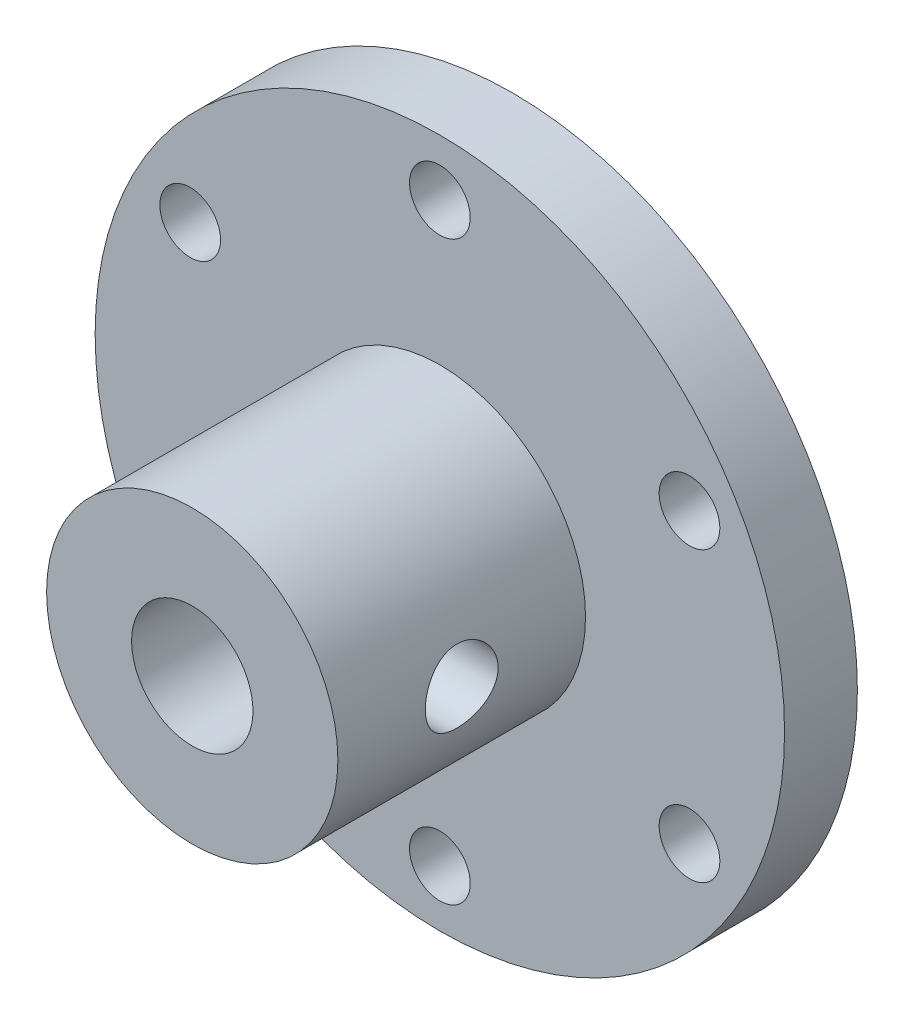
ISO-10303-21;
HEADER;
FILE_DESCRIPTION(('STEP AP214'),'2;1');
FILE_NAME('part.step','',(''),(''),'','','');
FILE_SCHEMA(('AUTOMOTIVE_DESIGN { 1 0 10303 214 1 1 1 1 }'));
ENDSEC;
DATA;
#1=APPLICATION_CONTEXT('core data for automotive mechanical design processes');
#2=APPLICATION_PROTOCOL_DEFINITION('international standard','automotive_design',2000,#1);
#3=PRODUCT_CONTEXT('',#1,'mechanical');
#4=PRODUCT('Part','Part','',(#3));
#5=PRODUCT_RELATED_PRODUCT_CATEGORY('part','',(#4));
#6=PRODUCT_DEFINITION_FORMATION('','',#4);
#7=PRODUCT_DEFINITION_CONTEXT('part definition',#1,'design');
#8=PRODUCT_DEFINITION('design','',#6,#7);
#9=PRODUCT_DEFINITION_SHAPE('','',#8);
#10=(LENGTH_UNIT() NAMED_UNIT(*) SI_UNIT(.MILLI.,.METRE.));
#11=(NAMED_UNIT(*) PLANE_ANGLE_UNIT() SI_UNIT($,.RADIAN.));
#12=(NAMED_UNIT(*) SI_UNIT($,.STERADIAN.) SOLID_ANGLE_UNIT());
#13=UNCERTAINTY_MEASURE_WITH_UNIT(LENGTH_MEASURE(1.E-05),#10,'distance_accuracy_value','');
#14=(GEOMETRIC_REPRESENTATION_CONTEXT(3) GLOBAL_UNCERTAINTY_ASSIGNED_CONTEXT((#13)) GLOBAL_UNIT_ASSIGNED_CONTEXT((#10,
#11,#12)) REPRESENTATION_CONTEXT('',''));
#15=CARTESIAN_POINT('',(0.,0.,0.));
#16=DIRECTION('',(0.,0.,1.));
#17=DIRECTION('',(1.,0.,0.));
#18=AXIS2_PLACEMENT_3D('',#15,#16,#17);
#19=CARTESIAN_POINT('',(0.,0.,8.5));
#20=DIRECTION('',(0.,0.,1.));
#21=DIRECTION('',(1.,0.,0.));
#22=AXIS2_PLACEMENT_3D('',#19,#20,#21);
#23=CYLINDRICAL_SURFACE('',#22,12.);
#24=CARTESIAN_POINT('',(12.,0.,21.7));
#25=CARTESIAN_POINT('',(11.9999957280688,0.165693664912072,21.6999928150083));
#26=CARTESIAN_POINT('',(11.9965326019779,0.331482235819507,21.6862218684386));
#27=CARTESIAN_POINT('',(11.9830467248771,0.658353835850523,21.6315669614701));
#28=CARTESIAN_POINT('',(11.9730175985364,0.819432132521742,21.5906566492892));
#29=CARTESIAN_POINT('',(11.9475117143636,1.13204869293379,21.4831183418444));
#30=CARTESIAN_POINT('',(11.9320423042694,1.28359950083382,21.416525022811));
#31=CARTESIAN_POINT('',(11.8973047647828,1.57336011717888,21.2596271489497));
#32=CARTESIAN_POINT('',(11.8780369283781,1.71157095336514,21.1693244227449));
#33=CARTESIAN_POINT('',(11.8373504038701,1.97358987521553,20.9656094560075));
#34=CARTESIAN_POINT('',(11.815898607181,2.09708539688872,20.8518018013217));
#35=CARTESIAN_POINT('',(11.7734768150593,2.32347646903238,20.6051222541331));
#36=CARTESIAN_POINT('',(11.7525069766943,2.42636538588808,20.4722442461153));
#37=CARTESIAN_POINT('',(11.713085365293,2.61009952988727,20.1887414660301));
#38=CARTESIAN_POINT('',(11.6946769146164,2.69058430328164,20.03787676286));
#39=CARTESIAN_POINT('',(11.6629766216083,2.82485050887593,19.7243211462168));
#40=CARTESIAN_POINT('',(11.6496788055226,2.87866313925013,19.5616443059887));
#41=CARTESIAN_POINT('',(11.6329502505524,2.9453717393525,19.2817883652429));
#42=CARTESIAN_POINT('',(11.62772978262,2.96582196889282,19.1664605922849));
#43=CARTESIAN_POINT('',(11.6207280430664,2.99313840725978,18.9341043479914));
#44=CARTESIAN_POINT('',(11.618946640573,3.00000513300127,18.8170759415436));
#45=CARTESIAN_POINT('',(11.6189548451231,2.99999273942974,18.5343974498881));
#46=CARTESIAN_POINT('',(11.6225306397938,2.98623642080573,18.368699792642));
#47=CARTESIAN_POINT('',(11.6364177572271,2.93164490603733,18.0420172911175));
#48=CARTESIAN_POINT('',(11.6467357131569,2.89078304193564,17.8810372513278));
#49=CARTESIAN_POINT('',(11.6728655332627,2.78338630466245,17.5686288556665));
#50=CARTESIAN_POINT('',(11.688669496401,2.71688833787691,17.4171871311521));
#51=CARTESIAN_POINT('',(11.7239804296828,2.56021536072405,17.1276112029638));
#52=CARTESIAN_POINT('',(11.7434871484607,2.47004195743034,16.9894760969148));
#53=CARTESIAN_POINT('',(11.7844864468452,2.26646114020776,16.72738001149));
#54=CARTESIAN_POINT('',(11.8060106893691,2.15262920183386,16.6037536770905));
#55=CARTESIAN_POINT('',(11.8483501328457,1.90584515126262,16.3771077273605));
#56=CARTESIAN_POINT('',(11.8691651177843,1.77288727725525,16.2740943442542));
#57=CARTESIAN_POINT('',(11.9080949390176,1.48930644060004,16.0902231746318));
#58=CARTESIAN_POINT('',(11.9261667116325,1.33845723582424,16.0097047642365));
#59=CARTESIAN_POINT('',(11.9571827004253,1.02493463089939,15.8753719353193));
#60=CARTESIAN_POINT('',(11.9701328195088,0.862275100148887,15.821526756666));
#61=CARTESIAN_POINT('',(11.9864068162275,0.582334104702279,15.7547313443809));
#62=CARTESIAN_POINT('',(11.9914779349958,0.466896521725037,15.7342422253925));
#63=CARTESIAN_POINT('',(11.9982759808765,0.234321744164557,15.7068742429655));
#64=CARTESIAN_POINT('',(12.0000030212656,0.11718460728703,15.6999949185117));
#65=CARTESIAN_POINT('',(11.9999957280688,-0.165693664912074,15.7000071849917));
#66=CARTESIAN_POINT('',(11.9965326019779,-0.331482235819508,15.7137781315614));
#67=CARTESIAN_POINT('',(11.9830467248771,-0.658353835850523,15.7684330385299));
#68=CARTESIAN_POINT('',(11.9730175985364,-0.819432132521743,15.8093433507108));
#69=CARTESIAN_POINT('',(11.9475117143636,-1.13204869293379,15.9168816581556));
#70=CARTESIAN_POINT('',(11.9320423042694,-1.28359950083381,15.983474977189));
#71=CARTESIAN_POINT('',(11.8973047647828,-1.57336011717887,16.1403728510503));
#72=CARTESIAN_POINT('',(11.8780369283781,-1.71157095336514,16.2306755772551));
#73=CARTESIAN_POINT('',(11.8373504038701,-1.97358987521553,16.4343905439925));
#74=CARTESIAN_POINT('',(11.815898607181,-2.09708539688872,16.5481981986783));
#75=CARTESIAN_POINT('',(11.7734768150593,-2.32347646903238,16.7948777458669));
#76=CARTESIAN_POINT('',(11.7525069766943,-2.42636538588808,16.9277557538847));
#77=CARTESIAN_POINT('',(11.713085365293,-2.61009952988726,17.2112585339699));
#78=CARTESIAN_POINT('',(11.6946769146164,-2.69058430328164,17.36212323714));
#79=CARTESIAN_POINT('',(11.6629766216083,-2.82485050887593,17.6756788537832));
#80=CARTESIAN_POINT('',(11.6496788055226,-2.87866313925013,17.8383556940113));
#81=CARTESIAN_POINT('',(11.6329502505524,-2.94537173935249,18.1182116347571));
#82=CARTESIAN_POINT('',(11.62772978262,-2.96582196889282,18.2335394077151));
#83=CARTESIAN_POINT('',(11.6207280430664,-2.99313840725978,18.4658956520086));
#84=CARTESIAN_POINT('',(11.618946640573,-3.00000513300126,18.5829240584564));
#85=CARTESIAN_POINT('',(11.6189548451231,-2.99999273942974,18.8656025501119));
#86=CARTESIAN_POINT('',(11.6225306397938,-2.98623642080573,19.0313002073581));
#87=CARTESIAN_POINT('',(11.6364177572271,-2.93164490603733,19.3579827088825));
#88=CARTESIAN_POINT('',(11.6467357131569,-2.89078304193563,19.5189627486722));
#89=CARTESIAN_POINT('',(11.6728655332627,-2.78338630466245,19.8313711443335));
#90=CARTESIAN_POINT('',(11.688669496401,-2.71688833787691,19.9828128688479));
#91=CARTESIAN_POINT('',(11.7239804296828,-2.56021536072405,20.2723887970362));
#92=CARTESIAN_POINT('',(11.7434871484607,-2.47004195743034,20.4105239030852));
#93=CARTESIAN_POINT('',(11.7844864468452,-2.26646114020776,20.67261998851));
#94=CARTESIAN_POINT('',(11.8060106893691,-2.15262920183386,20.7962463229095));
#95=CARTESIAN_POINT('',(11.8483501328457,-1.90584515126262,21.0228922726395));
#96=CARTESIAN_POINT('',(11.8691651177843,-1.77288727725525,21.1259056557458));
#97=CARTESIAN_POINT('',(11.9080949390176,-1.48930644060004,21.3097768253682));
#98=CARTESIAN_POINT('',(11.9261667116325,-1.33845723582424,21.3902952357635));
#99=CARTESIAN_POINT('',(11.9571827004253,-1.02493463089939,21.5246280646807));
#100=CARTESIAN_POINT('',(11.9701328195088,-0.862275100148888,21.578473243334));
#101=CARTESIAN_POINT('',(11.9864068162275,-0.58233410470228,21.6452686556191));
#102=CARTESIAN_POINT('',(11.9914779349957,-0.466896521725038,21.6657577746075));
#103=CARTESIAN_POINT('',(11.9982759808765,-0.234321744164558,21.6931257570345));
#104=CARTESIAN_POINT('',(12.0000030212656,-0.11718460728703,21.7000050814883));
#105=CARTESIAN_POINT('',(12.,0.,21.7));
#106=B_SPLINE_CURVE_WITH_KNOTS('',3,(#24,#25,#26,#27,#28,#29,#30,#31,#32,#33,#34,#35,#36,#37,
#38,#39,#40,#41,#42,#43,#44,#45,#46,#47,#48,#49,#50,#51,#52,#53,#54,#55,#56,#57,#58,#59,#60,#61,
#62,#63,#64,#65,#66,#67,#68,#69,#70,#71,#72,#73,#74,#75,#76,#77,#78,#79,#80,#81,#82,#83,#84,#85,
#86,#87,#88,#89,#90,#91,#92,#93,#94,#95,#96,#97,#98,#99,#100,#101,#102,#103,#104,#105),
.UNSPECIFIED.,.T.,.F.,(4,2,2,2,2,2,2,2,2,2,2,2,2,2,2,2,2,2,2,2,2,2,2,2,2,2,2,2,2,2,2,2,2,2,2,2,
2,2,2,2,4),(0.,0.496646768994113,0.993776479301541,1.49023732034909,1.98665988236264,
2.49223599127361,2.9979745930107,3.51143292555545,4.02428924459455,4.37522307199824,
4.7261435444973,5.22251644883704,5.71937843846639,6.21552778805021,6.71164346803405,
7.21757826769931,7.72366580389167,8.23702034208786,8.74978148277598,9.10104010300354,
9.45228682457151,9.94893359356562,10.4460633038731,10.9425241449206,11.4389467069341,
11.9445228158451,12.4502614175822,12.963719750127,13.4765760691661,13.8275098965697,
14.1784303690688,14.6748032734085,15.1716652630379,15.6678146126217,16.1639302926056,
16.6698650922708,17.1759526284632,17.6893071666594,18.2020683073475,18.553326927575,
18.904573649143),.UNSPECIFIED.);
#107=CARTESIAN_POINT('',(12.,0.,21.7));
#108=VERTEX_POINT('',#107);
#109=EDGE_CURVE('E147',#108,#108,#106,.T.);
#110=ORIENTED_EDGE('',*,*,#109,.T.);
#111=EDGE_LOOP('',(#110));
#112=FACE_BOUND('',#111,.T.);
#113=CARTESIAN_POINT('',(0.,0.,8.5));
#114=DIRECTION('',(0.,0.,1.));
#115=DIRECTION('',(1.,0.,0.));
#116=AXIS2_PLACEMENT_3D('',#113,#114,#115);
#117=CIRCLE('',#116,12.);
#118=CARTESIAN_POINT('',(12.,0.,8.5));
#119=VERTEX_POINT('',#118);
#120=EDGE_CURVE('E145',#119,#119,#117,.F.);
#121=ORIENTED_EDGE('',*,*,#120,.F.);
#122=EDGE_LOOP('',(#121));
#123=FACE_BOUND('',#122,.T.);
#124=CARTESIAN_POINT('',(0.,0.,28.9));
#125=DIRECTION('',(0.,0.,1.));
#126=DIRECTION('',(1.,0.,0.));
#127=AXIS2_PLACEMENT_3D('',#124,#125,#126);
#128=CIRCLE('',#127,12.);
#129=CARTESIAN_POINT('',(12.,0.,28.9));
#130=VERTEX_POINT('',#129);
#131=EDGE_CURVE('E18',#130,#130,#128,.T.);
#132=ORIENTED_EDGE('',*,*,#131,.F.);
#133=EDGE_LOOP('',(#132));
#134=FACE_BOUND('',#133,.T.);
#135=ADVANCED_FACE('F14',(#112,#123,#134),#23,.T.);
#136=CARTESIAN_POINT('',(0.,0.,28.9));
#137=DIRECTION('',(0.,0.,1.));
#138=DIRECTION('',(1.,0.,0.));
#139=AXIS2_PLACEMENT_3D('',#136,#137,#138);
#140=PLANE('',#139);
#141=CARTESIAN_POINT('',(0.,0.,28.9));
#142=DIRECTION('',(0.,0.,-1.));
#143=DIRECTION('',(-1.,0.,0.));
#144=AXIS2_PLACEMENT_3D('',#141,#142,#143);
#145=CIRCLE('',#144,5.);
#146=CARTESIAN_POINT('',(-5.,0.,28.9));
#147=VERTEX_POINT('',#146);
#148=EDGE_CURVE('E73',#147,#147,#145,.T.);
#149=ORIENTED_EDGE('',*,*,#148,.T.);
#150=EDGE_LOOP('',(#149));
#151=FACE_BOUND('',#150,.T.);
#152=ORIENTED_EDGE('',*,*,#131,.T.);
#153=EDGE_LOOP('',(#152));
#154=FACE_BOUND('',#153,.T.);
#155=ADVANCED_FACE('F96',(#151,#154),#140,.T.);
#156=CARTESIAN_POINT('',(0.,0.,18.7));
#157=DIRECTION('',(1.,0.,0.));
#158=DIRECTION('',(0.,0.,-1.));
#159=AXIS2_PLACEMENT_3D('',#156,#157,#158);
#160=CYLINDRICAL_SURFACE('',#159,3.);
#161=ORIENTED_EDGE('',*,*,#109,.F.);
#162=EDGE_LOOP('',(#161));
#163=FACE_BOUND('',#162,.T.);
#164=CARTESIAN_POINT('',(5.,0.,15.7));
#165=CARTESIAN_POINT('',(4.99999940658477,-0.0767678801192396,15.7000006638294));
#166=CARTESIAN_POINT('',(4.99822585644596,-0.153558360910736,15.7029533402229));
#167=CARTESIAN_POINT('',(4.99118391011725,-0.306542214499018,15.7147137136324));
#168=CARTESIAN_POINT('',(4.98591341133665,-0.382735200138676,15.7235249331885));
#169=CARTESIAN_POINT('',(4.96499419346863,-0.609803257129074,15.758647340939));
#170=CARTESIAN_POINT('',(4.94423817628654,-0.758979501121557,15.7936469314237));
#171=CARTESIAN_POINT('',(4.89123220723105,-1.04754257810959,15.8847730540608));
#172=CARTESIAN_POINT('',(4.85903938608577,-1.18697401956583,15.9407946510229));
#173=CARTESIAN_POINT('',(4.78590651439514,-1.45405202688125,16.0717215743141));
#174=CARTESIAN_POINT('',(4.74496874544088,-1.5817016542453,16.1466219760046));
#175=CARTESIAN_POINT('',(4.6541064732048,-1.83260392517862,16.3195513301363));
#176=CARTESIAN_POINT('',(4.60373407277412,-1.95477324953863,16.4189112381204));
#177=CARTESIAN_POINT('',(4.50060688577176,-2.18176827597789,16.6349382488957));
#178=CARTESIAN_POINT('',(4.44784918714059,-2.28657200763446,16.7516269270842));
#179=CARTESIAN_POINT('',(4.33822877092131,-2.48888664922791,17.0158304074759));
#180=CARTESIAN_POINT('',(4.28165482129482,-2.58393171086636,17.1653703345512));
#181=CARTESIAN_POINT('',(4.17877805624258,-2.74721032414936,17.4816449452268));
#182=CARTESIAN_POINT('',(4.13246121160821,-2.81548059698938,17.6483556800609));
#183=CARTESIAN_POINT('',(4.06520495639378,-2.91150900031344,17.9620096892649));
#184=CARTESIAN_POINT('',(4.04110959631816,-2.94451164891567,18.1066550775168));
#185=CARTESIAN_POINT('',(4.00851821707227,-2.98874141767498,18.4008718283708));
#186=CARTESIAN_POINT('',(3.99999982256373,-2.99999977346019,18.5504358106183));
#187=CARTESIAN_POINT('',(4.00000017905266,-3.00000022860352,18.850926672365));
#188=CARTESIAN_POINT('',(4.00867484002758,-2.98853627761798,19.0018535556553));
#189=CARTESIAN_POINT('',(4.04184585380817,-2.94350523117549,19.2986372285078));
#190=CARTESIAN_POINT('',(4.06636051746079,-2.90991255430844,19.4444879441847));
#191=CARTESIAN_POINT('',(4.1272476102406,-2.82286919080426,19.7261656395809));
#192=CARTESIAN_POINT('',(4.16353352125618,-2.76956300898167,19.8620571458067));
#193=CARTESIAN_POINT('',(4.24371784163998,-2.64505835505252,20.1228752513206));
#194=CARTESIAN_POINT('',(4.28761852590751,-2.57385453319611,20.2477985570331));
#195=CARTESIAN_POINT('',(4.38457062340518,-2.40542826131656,20.499894402425));
#196=CARTESIAN_POINT('',(4.43808463292361,-2.30608927828072,20.6254752487185));
#197=CARTESIAN_POINT('',(4.54452181352423,-2.08854170196272,20.8595239641548));
#198=CARTESIAN_POINT('',(4.59744447461112,-1.97031799153217,20.9679779838505));
#199=CARTESIAN_POINT('',(4.70352345672635,-1.70285624255232,21.1762911741899));
#200=CARTESIAN_POINT('',(4.75608536975912,-1.55164647299247,21.2739503656662));
#201=CARTESIAN_POINT('',(4.84889364787066,-1.23122585670127,21.4416513780307));
#202=CARTESIAN_POINT('',(4.88915660884575,-1.06203968636522,21.5117304520128));
#203=CARTESIAN_POINT('',(4.9463758590619,-0.744461592464488,21.6099634002227));
#204=CARTESIAN_POINT('',(4.96631834251902,-0.598289219453495,21.6435750363725));
#205=CARTESIAN_POINT('',(4.99312645036289,-0.301410439906223,21.6885865062652));
#206=CARTESIAN_POINT('',(5.00000005056663,-0.150706855814995,21.6999998874925));
#207=CARTESIAN_POINT('',(4.99999994841007,0.153756652819247,21.7000001147843));
#208=CARTESIAN_POINT('',(4.99284523226386,0.307516711119343,21.6881203549708));
#209=CARTESIAN_POINT('',(4.96495385242821,0.610218227121317,21.6412778103412));
#210=CARTESIAN_POINT('',(4.94421137738968,0.75915759444665,21.60630514887));
#211=CARTESIAN_POINT('',(4.89123745097885,1.04748196309147,21.515237801128));
#212=CARTESIAN_POINT('',(4.85905368077838,1.18690379631333,21.4592307211368));
#213=CARTESIAN_POINT('',(4.78592508136073,1.45400223927126,21.3283118838233));
#214=CARTESIAN_POINT('',(4.7449786119792,1.58167664376792,21.2533965868707));
#215=CARTESIAN_POINT('',(4.65410533444338,1.83260466479083,21.0804467341317));
#216=CARTESIAN_POINT('',(4.60373175961595,1.95477818001855,20.981084550023));
#217=CARTESIAN_POINT('',(4.50060450017407,2.18177368533436,20.7650561214998));
#218=CARTESIAN_POINT('',(4.4478480089588,2.28657449792118,20.6483690814755));
#219=CARTESIAN_POINT('',(4.33822161139285,2.48889950821809,20.3841536299722));
#220=CARTESIAN_POINT('',(4.28164087493739,2.58395447207946,20.2345978341858));
#221=CARTESIAN_POINT('',(4.17876645177402,2.74722811162042,19.9183083802647));
#222=CARTESIAN_POINT('',(4.13245621549003,2.81549009939058,19.7516030005318));
#223=CARTESIAN_POINT('',(4.06709260649502,2.90881201880439,19.4468071604126));
#224=CARTESIAN_POINT('',(4.04415768429101,2.94032391641722,19.3115281305296));
#225=CARTESIAN_POINT('',(4.01180617496173,2.98432343373934,19.0363927004767));
#226=CARTESIAN_POINT('',(4.00237279386637,2.99683468869406,18.896542208524));
#227=CARTESIAN_POINT('',(3.99841844855993,3.00211017799949,18.6159769649807));
#228=CARTESIAN_POINT('',(4.0039267438292,2.99483566687475,18.4752610567987));
#229=CARTESIAN_POINT('',(4.02906524203337,2.96092118830073,18.1974423573946));
#230=CARTESIAN_POINT('',(4.04870605773657,2.93426666734121,18.0603423617845));
#231=CARTESIAN_POINT('',(4.09906378425851,2.86347838597558,17.7949392752306));
#232=CARTESIAN_POINT('',(4.12963434304006,2.81957486013186,17.6665454273518));
#233=CARTESIAN_POINT('',(4.19854117141906,2.71590096576278,17.4186095675205));
#234=CARTESIAN_POINT('',(4.23688025810758,2.65612483892872,17.2990707882052));
#235=CARTESIAN_POINT('',(4.32510584396987,2.51036101612526,17.0500337894198));
#236=CARTESIAN_POINT('',(4.37583935002237,2.42161791826769,16.922447660612));
#237=CARTESIAN_POINT('',(4.4786105368111,2.22582409506714,16.682650130202));
#238=CARTESIAN_POINT('',(4.5306494582237,2.11875534318594,16.5704540651154));
#239=CARTESIAN_POINT('',(4.63871485957296,1.87161598340443,16.3487644861358));
#240=CARTESIAN_POINT('',(4.69428548789398,1.72902537232941,16.2418294867533));
#241=CARTESIAN_POINT('',(4.7954573450525,1.42450932713309,16.0537391998717));
#242=CARTESIAN_POINT('',(4.84106560916232,1.2625976630096,15.9725657015197));
#243=CARTESIAN_POINT('',(4.90964574687095,0.956575583185748,15.8528048639642));
#244=CARTESIAN_POINT('',(4.93529061622494,0.815087739734835,15.8090152330965));
#245=CARTESIAN_POINT('',(4.97440219716416,0.525803416787641,15.742736179433));
#246=CARTESIAN_POINT('',(4.98790362443496,0.378026194061149,15.7201860284077));
#247=CARTESIAN_POINT('',(4.99649095904262,0.191190845528232,15.7058522240954));
#248=CARTESIAN_POINT('',(4.99780509806329,0.153005067888628,15.7036595997845));
#249=CARTESIAN_POINT('',(4.99955982246957,0.0765480732755262,15.7007332287402));
#250=CARTESIAN_POINT('',(5.00000029587978,0.0382768459793935,15.6999996690114));
#251=CARTESIAN_POINT('',(5.,0.,15.7));
#252=B_SPLINE_CURVE_WITH_KNOTS('',3,(#164,#165,#166,#167,#168,#169,#170,#171,#172,#173,#174,
#175,#176,#177,#178,#179,#180,#181,#182,#183,#184,#185,#186,#187,#188,#189,#190,#191,#192,#193,
#194,#195,#196,#197,#198,#199,#200,#201,#202,#203,#204,#205,#206,#207,#208,#209,#210,#211,#212,
#213,#214,#215,#216,#217,#218,#219,#220,#221,#222,#223,#224,#225,#226,#227,#228,#229,#230,#231,
#232,#233,#234,#235,#236,#237,#238,#239,#240,#241,#242,#243,#244,#245,#246,#247,#248,#249,#250,
#251),.UNSPECIFIED.,.T.,.F.,(4,2,2,2,2,2,2,2,2,2,2,2,2,2,2,2,2,2,2,2,2,2,2,2,2,2,2,2,2,2,2,2,2,
2,2,2,2,2,2,2,2,2,2,4),(0.,0.230257628627854,0.460653828582439,0.922002128233925,
1.38107751259174,1.8400332683565,2.33409745946189,2.82878203022562,3.38406195944245,
3.93857764541513,4.38728575357606,4.83534881272786,5.2874935861996,5.74016197079453,
6.18957591196204,6.63912434668242,7.14362492358481,7.64853139388259,8.20807377142116,
8.76685774684844,9.2186700121375,9.67020645201724,10.1308804621436,10.5917516267037,
11.0507242195282,11.5097827961251,12.0038582149497,12.498531556907,13.0538801243121,
13.6083272106418,14.0288827960966,14.4489148150716,14.8697699536212,15.2909414621822,
15.7066725140855,16.1225545926641,16.6111392420927,17.1002072929513,17.6574736553111,
18.2143452030345,18.6634028299731,19.1111725719921,19.2259654565026,19.340773052764),.UNSPECIFIED.);
#253=CARTESIAN_POINT('',(5.,0.,15.7));
#254=VERTEX_POINT('',#253);
#255=EDGE_CURVE('E65',#254,#254,#252,.T.);
#256=ORIENTED_EDGE('',*,*,#255,.T.);
#257=EDGE_LOOP('',(#256));
#258=FACE_BOUND('',#257,.T.);
#259=ADVANCED_FACE('F75',(#163,#258),#160,.F.);
#260=CARTESIAN_POINT('',(0.,0.,8.5));
#261=DIRECTION('',(0.,0.,1.));
#262=DIRECTION('',(1.,0.,0.));
#263=AXIS2_PLACEMENT_3D('',#260,#261,#262);
#264=PLANE('',#263);
#265=ORIENTED_EDGE('',*,*,#120,.T.);
#266=EDGE_LOOP('',(#265));
#267=FACE_BOUND('',#266,.T.);
#268=CARTESIAN_POINT('',(20.5681033398804,-11.875,8.5));
#269=DIRECTION('',(0.,0.,1.));
#270=DIRECTION('',(1.,0.,0.));
#271=AXIS2_PLACEMENT_3D('',#268,#269,#270);
#272=CIRCLE('',#271,2.50000450678288);
#273=CARTESIAN_POINT('',(23.0681078466633,-11.875,8.5));
#274=VERTEX_POINT('',#273);
#275=EDGE_CURVE('E47',#274,#274,#272,.F.);
#276=ORIENTED_EDGE('',*,*,#275,.T.);
#277=EDGE_LOOP('',(#276));
#278=FACE_BOUND('',#277,.T.);
#279=CARTESIAN_POINT('',(-20.5681033398804,11.875,8.5));
#280=DIRECTION('',(0.,0.,1.));
#281=DIRECTION('',(1.,0.,0.));
#282=AXIS2_PLACEMENT_3D('',#279,#280,#281);
#283=CIRCLE('',#282,2.50000450678288);
#284=CARTESIAN_POINT('',(-18.0680988330975,11.875,8.5));
#285=VERTEX_POINT('',#284);
#286=EDGE_CURVE('E50',#285,#285,#283,.F.);
#287=ORIENTED_EDGE('',*,*,#286,.T.);
#288=EDGE_LOOP('',(#287));
#289=FACE_BOUND('',#288,.T.);
#290=CARTESIAN_POINT('',(20.5681033398804,11.875,8.5));
#291=DIRECTION('',(0.,0.,1.));
#292=DIRECTION('',(1.,0.,0.));
#293=AXIS2_PLACEMENT_3D('',#290,#291,#292);
#294=CIRCLE('',#293,2.50000450678288);
#295=CARTESIAN_POINT('',(23.0681078466633,11.875,8.5));
#296=VERTEX_POINT('',#295);
#297=EDGE_CURVE('E53',#296,#296,#294,.F.);
#298=ORIENTED_EDGE('',*,*,#297,.T.);
#299=EDGE_LOOP('',(#298));
#300=FACE_BOUND('',#299,.T.);
#301=CARTESIAN_POINT('',(-20.5681033398804,-11.875,8.5));
#302=DIRECTION('',(0.,0.,1.));
#303=DIRECTION('',(1.,0.,0.));
#304=AXIS2_PLACEMENT_3D('',#301,#302,#303);
#305=CIRCLE('',#304,2.50000450678288);
#306=CARTESIAN_POINT('',(-18.0680988330975,-11.875,8.5));
#307=VERTEX_POINT('',#306);
#308=EDGE_CURVE('E56',#307,#307,#305,.F.);
#309=ORIENTED_EDGE('',*,*,#308,.T.);
#310=EDGE_LOOP('',(#309));
#311=FACE_BOUND('',#310,.T.);
#312=CARTESIAN_POINT('',(0.,-23.75,8.5));
#313=DIRECTION('',(0.,0.,1.));
#314=DIRECTION('',(1.,0.,0.));
#315=AXIS2_PLACEMENT_3D('',#312,#313,#314);
#316=CIRCLE('',#315,2.50000450678288);
#317=CARTESIAN_POINT('',(2.50000450678288,-23.75,8.5));
#318=VERTEX_POINT('',#317);
#319=EDGE_CURVE('E59',#318,#318,#316,.F.);
#320=ORIENTED_EDGE('',*,*,#319,.T.);
#321=EDGE_LOOP('',(#320));
#322=FACE_BOUND('',#321,.T.);
#323=CARTESIAN_POINT('',(0.,23.75,8.5));
#324=DIRECTION('',(0.,0.,1.));
#325=DIRECTION('',(1.,0.,0.));
#326=AXIS2_PLACEMENT_3D('',#323,#324,#325);
#327=CIRCLE('',#326,2.50000450678288);
#328=CARTESIAN_POINT('',(2.50000450678288,23.75,8.5));
#329=VERTEX_POINT('',#328);
#330=EDGE_CURVE('E62',#329,#329,#327,.F.);
#331=ORIENTED_EDGE('',*,*,#330,.T.);
#332=EDGE_LOOP('',(#331));
#333=FACE_BOUND('',#332,.T.);
#334=CARTESIAN_POINT('',(0.,0.,8.5));
#335=DIRECTION('',(0.,0.,1.));
#336=DIRECTION('',(1.,0.,0.));
#337=AXIS2_PLACEMENT_3D('',#334,#335,#336);
#338=CIRCLE('',#337,28.4);
#339=CARTESIAN_POINT('',(28.4,0.,8.5));
#340=VERTEX_POINT('',#339);
#341=EDGE_CURVE('E143',#340,#340,#338,.F.);
#342=ORIENTED_EDGE('',*,*,#341,.F.);
#343=EDGE_LOOP('',(#342));
#344=FACE_BOUND('',#343,.T.);
#345=ADVANCED_FACE('F88',(#267,#278,#289,#300,#311,#322,#333,#344),#264,.T.);
#346=CARTESIAN_POINT('',(0.,0.,2.5));
#347=DIRECTION('',(0.,0.,1.));
#348=DIRECTION('',(1.,0.,0.));
#349=AXIS2_PLACEMENT_3D('',#346,#347,#348);
#350=CYLINDRICAL_SURFACE('',#349,28.4);
#351=CARTESIAN_POINT('',(0.,0.,2.5));
#352=DIRECTION('',(0.,0.,1.));
#353=DIRECTION('',(1.,0.,0.));
#354=AXIS2_PLACEMENT_3D('',#351,#352,#353);
#355=CIRCLE('',#354,28.4);
#356=CARTESIAN_POINT('',(28.4,0.,2.5));
#357=VERTEX_POINT('',#356);
#358=EDGE_CURVE('E44',#357,#357,#355,.T.);
#359=ORIENTED_EDGE('',*,*,#358,.T.);
#360=EDGE_LOOP('',(#359));
#361=FACE_BOUND('',#360,.T.);
#362=ORIENTED_EDGE('',*,*,#341,.T.);
#363=EDGE_LOOP('',(#362));
#364=FACE_BOUND('',#363,.T.);
#365=ADVANCED_FACE('F84',(#361,#364),#350,.T.);
#366=CARTESIAN_POINT('',(0.,0.,28.9));
#367=DIRECTION('',(0.,0.,-1.));
#368=DIRECTION('',(-1.,0.,0.));
#369=AXIS2_PLACEMENT_3D('',#366,#367,#368);
#370=CYLINDRICAL_SURFACE('',#369,5.);
#371=ORIENTED_EDGE('',*,*,#255,.F.);
#372=EDGE_LOOP('',(#371));
#373=FACE_BOUND('',#372,.T.);
#374=CARTESIAN_POINT('',(0.,0.,2.5));
#375=DIRECTION('',(0.,0.,-1.));
#376=DIRECTION('',(-1.,0.,0.));
#377=AXIS2_PLACEMENT_3D('',#374,#375,#376);
#378=CIRCLE('',#377,5.);
#379=CARTESIAN_POINT('',(-5.,0.,2.5));
#380=VERTEX_POINT('',#379);
#381=EDGE_CURVE('E41',#380,#380,#378,.T.);
#382=ORIENTED_EDGE('',*,*,#381,.T.);
#383=EDGE_LOOP('',(#382));
#384=FACE_BOUND('',#383,.T.);
#385=ORIENTED_EDGE('',*,*,#148,.F.);
#386=EDGE_LOOP('',(#385));
#387=FACE_BOUND('',#386,.T.);
#388=ADVANCED_FACE('F78',(#373,#384,#387),#370,.F.);
#389=CARTESIAN_POINT('',(0.,23.75,0.));
#390=DIRECTION('',(0.,0.,1.));
#391=DIRECTION('',(1.,0.,0.));
#392=AXIS2_PLACEMENT_3D('',#389,#390,#391);
#393=CYLINDRICAL_SURFACE('',#392,2.50000450678288);
#394=ORIENTED_EDGE('',*,*,#330,.F.);
#395=EDGE_LOOP('',(#394));
#396=FACE_BOUND('',#395,.T.);
#397=CARTESIAN_POINT('',(0.,23.75,2.5));
#398=DIRECTION('',(0.,0.,1.));
#399=DIRECTION('',(1.,0.,0.));
#400=AXIS2_PLACEMENT_3D('',#397,#398,#399);
#401=CIRCLE('',#400,2.50000450678288);
#402=CARTESIAN_POINT('',(2.50000450678288,23.75,2.5));
#403=VERTEX_POINT('',#402);
#404=EDGE_CURVE('E38',#403,#403,#401,.F.);
#405=ORIENTED_EDGE('',*,*,#404,.T.);
#406=EDGE_LOOP('',(#405));
#407=FACE_BOUND('',#406,.T.);
#408=ADVANCED_FACE('F83',(#396,#407),#393,.F.);
#409=CARTESIAN_POINT('',(0.,-23.75,0.));
#410=DIRECTION('',(0.,0.,1.));
#411=DIRECTION('',(1.,0.,0.));
#412=AXIS2_PLACEMENT_3D('',#409,#410,#411);
#413=CYLINDRICAL_SURFACE('',#412,2.50000450678288);
#414=ORIENTED_EDGE('',*,*,#319,.F.);
#415=EDGE_LOOP('',(#414));
#416=FACE_BOUND('',#415,.T.);
#417=CARTESIAN_POINT('',(0.,-23.75,2.5));
#418=DIRECTION('',(0.,0.,1.));
#419=DIRECTION('',(1.,0.,0.));
#420=AXIS2_PLACEMENT_3D('',#417,#418,#419);
#421=CIRCLE('',#420,2.50000450678288);
#422=CARTESIAN_POINT('',(2.50000450678288,-23.75,2.5));
#423=VERTEX_POINT('',#422);
#424=EDGE_CURVE('E35',#423,#423,#421,.F.);
#425=ORIENTED_EDGE('',*,*,#424,.T.);
#426=EDGE_LOOP('',(#425));
#427=FACE_BOUND('',#426,.T.);
#428=ADVANCED_FACE('F122',(#416,#427),#413,.F.);
#429=CARTESIAN_POINT('',(-20.5681033398804,-11.875,0.));
#430=DIRECTION('',(0.,0.,1.));
#431=DIRECTION('',(1.,0.,0.));
#432=AXIS2_PLACEMENT_3D('',#429,#430,#431);
#433=CYLINDRICAL_SURFACE('',#432,2.50000450678288);
#434=ORIENTED_EDGE('',*,*,#308,.F.);
#435=EDGE_LOOP('',(#434));
#436=FACE_BOUND('',#435,.T.);
#437=CARTESIAN_POINT('',(-20.5681033398804,-11.875,2.5));
#438=DIRECTION('',(0.,0.,1.));
#439=DIRECTION('',(1.,0.,0.));
#440=AXIS2_PLACEMENT_3D('',#437,#438,#439);
#441=CIRCLE('',#440,2.50000450678288);
#442=CARTESIAN_POINT('',(-18.0680988330975,-11.875,2.5));
#443=VERTEX_POINT('',#442);
#444=EDGE_CURVE('E32',#443,#443,#441,.F.);
#445=ORIENTED_EDGE('',*,*,#444,.T.);
#446=EDGE_LOOP('',(#445));
#447=FACE_BOUND('',#446,.T.);
#448=ADVANCED_FACE('F119',(#436,#447),#433,.F.);
#449=CARTESIAN_POINT('',(20.5681033398804,11.875,0.));
#450=DIRECTION('',(0.,0.,1.));
#451=DIRECTION('',(1.,0.,0.));
#452=AXIS2_PLACEMENT_3D('',#449,#450,#451);
#453=CYLINDRICAL_SURFACE('',#452,2.50000450678288);
#454=ORIENTED_EDGE('',*,*,#297,.F.);
#455=EDGE_LOOP('',(#454));
#456=FACE_BOUND('',#455,.T.);
#457=CARTESIAN_POINT('',(20.5681033398804,11.875,2.5));
#458=DIRECTION('',(0.,0.,1.));
#459=DIRECTION('',(1.,0.,0.));
#460=AXIS2_PLACEMENT_3D('',#457,#458,#459);
#461=CIRCLE('',#460,2.50000450678288);
#462=CARTESIAN_POINT('',(23.0681078466633,11.875,2.5));
#463=VERTEX_POINT('',#462);
#464=EDGE_CURVE('E27',#463,#463,#461,.F.);
#465=ORIENTED_EDGE('',*,*,#464,.T.);
#466=EDGE_LOOP('',(#465));
#467=FACE_BOUND('',#466,.T.);
#468=ADVANCED_FACE('F115',(#456,#467),#453,.F.);
#469=CARTESIAN_POINT('',(-20.5681033398804,11.875,0.));
#470=DIRECTION('',(0.,0.,1.));
#471=DIRECTION('',(1.,0.,0.));
#472=AXIS2_PLACEMENT_3D('',#469,#470,#471);
#473=CYLINDRICAL_SURFACE('',#472,2.50000450678288);
#474=ORIENTED_EDGE('',*,*,#286,.F.);
#475=EDGE_LOOP('',(#474));
#476=FACE_BOUND('',#475,.T.);
#477=CARTESIAN_POINT('',(-20.5681033398804,11.875,2.5));
#478=DIRECTION('',(0.,0.,1.));
#479=DIRECTION('',(1.,0.,0.));
#480=AXIS2_PLACEMENT_3D('',#477,#478,#479);
#481=CIRCLE('',#480,2.50000450678288);
#482=CARTESIAN_POINT('',(-18.0680988330975,11.875,2.5));
#483=VERTEX_POINT('',#482);
#484=EDGE_CURVE('E22',#483,#483,#481,.F.);
#485=ORIENTED_EDGE('',*,*,#484,.T.);
#486=EDGE_LOOP('',(#485));
#487=FACE_BOUND('',#486,.T.);
#488=ADVANCED_FACE('F108',(#476,#487),#473,.F.);
#489=CARTESIAN_POINT('',(20.5681033398804,-11.875,0.));
#490=DIRECTION('',(0.,0.,1.));
#491=DIRECTION('',(1.,0.,0.));
#492=AXIS2_PLACEMENT_3D('',#489,#490,#491);
#493=CYLINDRICAL_SURFACE('',#492,2.50000450678288);
#494=ORIENTED_EDGE('',*,*,#275,.F.);
#495=EDGE_LOOP('',(#494));
#496=FACE_BOUND('',#495,.T.);
#497=CARTESIAN_POINT('',(20.5681033398804,-11.875,2.5));
#498=DIRECTION('',(0.,0.,1.));
#499=DIRECTION('',(1.,0.,0.));
#500=AXIS2_PLACEMENT_3D('',#497,#498,#499);
#501=CIRCLE('',#500,2.50000450678288);
#502=CARTESIAN_POINT('',(23.0681078466633,-11.875,2.5));
#503=VERTEX_POINT('',#502);
#504=EDGE_CURVE('E10',#503,#503,#501,.F.);
#505=ORIENTED_EDGE('',*,*,#504,.T.);
#506=EDGE_LOOP('',(#505));
#507=FACE_BOUND('',#506,.T.);
#508=ADVANCED_FACE('F102',(#496,#507),#493,.F.);
#509=CARTESIAN_POINT('',(0.,0.,2.5));
#510=DIRECTION('',(0.,0.,1.));
#511=DIRECTION('',(1.,0.,0.));
#512=AXIS2_PLACEMENT_3D('',#509,#510,#511);
#513=PLANE('',#512);
#514=ORIENTED_EDGE('',*,*,#504,.F.);
#515=EDGE_LOOP('',(#514));
#516=FACE_BOUND('',#515,.T.);
#517=ORIENTED_EDGE('',*,*,#484,.F.);
#518=EDGE_LOOP('',(#517));
#519=FACE_BOUND('',#518,.T.);
#520=ORIENTED_EDGE('',*,*,#464,.F.);
#521=EDGE_LOOP('',(#520));
#522=FACE_BOUND('',#521,.T.);
#523=ORIENTED_EDGE('',*,*,#444,.F.);
#524=EDGE_LOOP('',(#523));
#525=FACE_BOUND('',#524,.T.);
#526=ORIENTED_EDGE('',*,*,#424,.F.);
#527=EDGE_LOOP('',(#526));
#528=FACE_BOUND('',#527,.T.);
#529=ORIENTED_EDGE('',*,*,#404,.F.);
#530=EDGE_LOOP('',(#529));
#531=FACE_BOUND('',#530,.T.);
#532=ORIENTED_EDGE('',*,*,#381,.F.);
#533=EDGE_LOOP('',(#532));
#534=FACE_BOUND('',#533,.T.);
#535=ORIENTED_EDGE('',*,*,#358,.F.);
#536=EDGE_LOOP('',(#535));
#537=FACE_BOUND('',#536,.T.);
#538=ADVANCED_FACE('F100',(#516,#519,#522,#525,#528,#531,#534,#537),#513,.F.);
#539=CLOSED_SHELL('',(#135,#155,#259,#345,#365,#388,#408,#428,#448,#468,#488,#508,#538));
#540=MANIFOLD_SOLID_BREP('B1',#539);
#541=ADVANCED_BREP_SHAPE_REPRESENTATION('',(#18,#540),#14);
#542=SHAPE_DEFINITION_REPRESENTATION(#9,#541);
ENDSEC;
END-ISO-10303-21;
